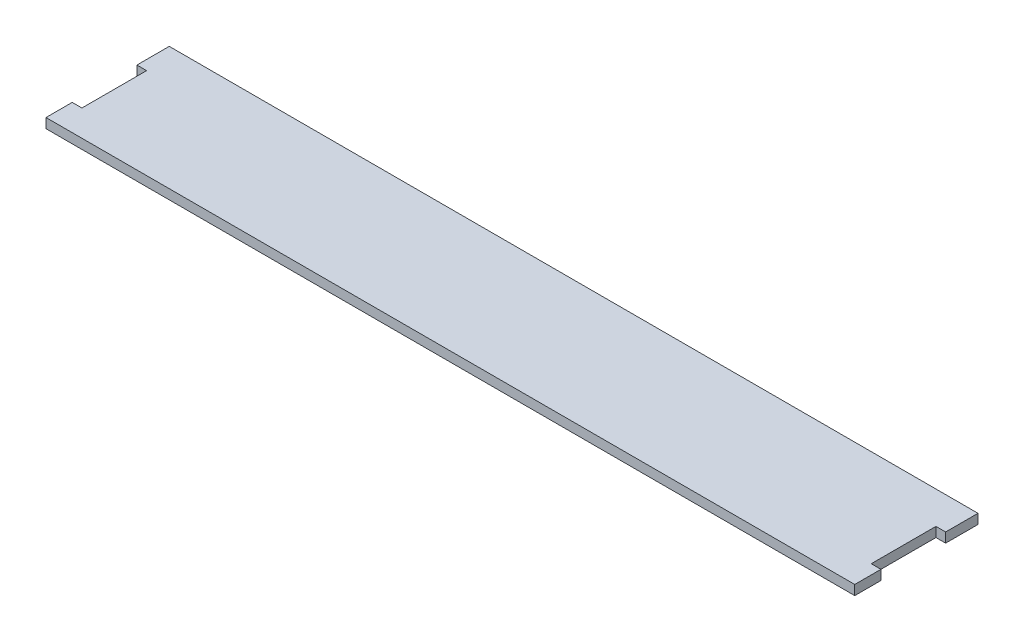
ISO-10303-21;
HEADER;
FILE_DESCRIPTION(('STEP AP214'),'2;1');
FILE_NAME('part.step','',(''),(''),'','','');
FILE_SCHEMA(('AUTOMOTIVE_DESIGN { 1 0 10303 214 1 1 1 1 }'));
ENDSEC;
DATA;
#1=APPLICATION_CONTEXT('core data for automotive mechanical design processes');
#2=APPLICATION_PROTOCOL_DEFINITION('international standard','automotive_design',2000,#1);
#3=PRODUCT_CONTEXT('',#1,'mechanical');
#4=PRODUCT('Part','Part','',(#3));
#5=PRODUCT_RELATED_PRODUCT_CATEGORY('part','',(#4));
#6=PRODUCT_DEFINITION_FORMATION('','',#4);
#7=PRODUCT_DEFINITION_CONTEXT('part definition',#1,'design');
#8=PRODUCT_DEFINITION('design','',#6,#7);
#9=PRODUCT_DEFINITION_SHAPE('','',#8);
#10=(LENGTH_UNIT() NAMED_UNIT(*) SI_UNIT(.MILLI.,.METRE.));
#11=(NAMED_UNIT(*) PLANE_ANGLE_UNIT() SI_UNIT($,.RADIAN.));
#12=(NAMED_UNIT(*) SI_UNIT($,.STERADIAN.) SOLID_ANGLE_UNIT());
#13=UNCERTAINTY_MEASURE_WITH_UNIT(LENGTH_MEASURE(1.E-05),#10,'distance_accuracy_value','');
#14=(GEOMETRIC_REPRESENTATION_CONTEXT(3) GLOBAL_UNCERTAINTY_ASSIGNED_CONTEXT((#13)) GLOBAL_UNIT_ASSIGNED_CONTEXT((#10,
#11,#12)) REPRESENTATION_CONTEXT('',''));
#15=CARTESIAN_POINT('',(0.,0.,0.));
#16=DIRECTION('',(0.,0.,1.));
#17=DIRECTION('',(1.,0.,0.));
#18=AXIS2_PLACEMENT_3D('',#15,#16,#17);
#19=CARTESIAN_POINT('',(250.,3.,0.));
#20=DIRECTION('',(-1.,0.,0.));
#21=DIRECTION('',(0.,0.,1.));
#22=AXIS2_PLACEMENT_3D('',#19,#20,#21);
#23=PLANE('',#22);
#24=DIRECTION('',(0.,0.,-1.));
#25=VECTOR('',#24,1.);
#26=CARTESIAN_POINT('',(250.,3.,0.));
#27=LINE('',#26,#25);
#28=CARTESIAN_POINT('',(250.,3.,-1.9));
#29=VERTEX_POINT('',#28);
#30=CARTESIAN_POINT('',(250.,3.,-10.));
#31=VERTEX_POINT('',#30);
#32=EDGE_CURVE('E135',#29,#31,#27,.T.);
#33=ORIENTED_EDGE('',*,*,#32,.F.);
#34=DIRECTION('',(0.,-1.,0.));
#35=VECTOR('',#34,1.);
#36=CARTESIAN_POINT('',(250.,3.001,-1.9));
#37=LINE('',#36,#35);
#38=CARTESIAN_POINT('',(250.,0.,-1.9));
#39=VERTEX_POINT('',#38);
#40=EDGE_CURVE('E122',#29,#39,#37,.T.);
#41=ORIENTED_EDGE('',*,*,#40,.T.);
#42=DIRECTION('',(0.,0.,-1.));
#43=VECTOR('',#42,1.);
#44=CARTESIAN_POINT('',(250.,0.,0.));
#45=LINE('',#44,#43);
#46=CARTESIAN_POINT('',(250.,0.,-10.));
#47=VERTEX_POINT('',#46);
#48=EDGE_CURVE('E133',#39,#47,#45,.T.);
#49=ORIENTED_EDGE('',*,*,#48,.T.);
#50=DIRECTION('',(0.,1.,0.));
#51=VECTOR('',#50,1.);
#52=CARTESIAN_POINT('',(250.,0.,-10.));
#53=LINE('',#52,#51);
#54=EDGE_CURVE('E185',#47,#31,#53,.T.);
#55=ORIENTED_EDGE('',*,*,#54,.T.);
#56=EDGE_LOOP('',(#33,#41,#49,#55));
#57=FACE_BOUND('',#56,.T.);
#58=ADVANCED_FACE('F33',(#57),#23,.F.);
#59=CARTESIAN_POINT('',(0.,3.,0.));
#60=DIRECTION('',(1.,0.,0.));
#61=DIRECTION('',(0.,0.,-1.));
#62=AXIS2_PLACEMENT_3D('',#59,#60,#61);
#63=PLANE('',#62);
#64=DIRECTION('',(0.,0.,1.));
#65=VECTOR('',#64,1.);
#66=CARTESIAN_POINT('',(0.,0.,0.));
#67=LINE('',#66,#65);
#68=CARTESIAN_POINT('',(0.,0.,-40.));
#69=VERTEX_POINT('',#68);
#70=CARTESIAN_POINT('',(0.,0.,-30.));
#71=VERTEX_POINT('',#70);
#72=EDGE_CURVE('E147',#69,#71,#67,.T.);
#73=ORIENTED_EDGE('',*,*,#72,.T.);
#74=DIRECTION('',(0.,1.,0.));
#75=VECTOR('',#74,1.);
#76=CARTESIAN_POINT('',(0.,0.,-30.));
#77=LINE('',#76,#75);
#78=CARTESIAN_POINT('',(0.,3.,-30.));
#79=VERTEX_POINT('',#78);
#80=EDGE_CURVE('E172',#71,#79,#77,.T.);
#81=ORIENTED_EDGE('',*,*,#80,.T.);
#82=DIRECTION('',(0.,0.,1.));
#83=VECTOR('',#82,1.);
#84=CARTESIAN_POINT('',(0.,3.,0.));
#85=LINE('',#84,#83);
#86=CARTESIAN_POINT('',(0.,3.,-40.));
#87=VERTEX_POINT('',#86);
#88=EDGE_CURVE('E163',#87,#79,#85,.T.);
#89=ORIENTED_EDGE('',*,*,#88,.F.);
#90=DIRECTION('',(0.,-1.,0.));
#91=VECTOR('',#90,1.);
#92=CARTESIAN_POINT('',(0.,3.,-40.));
#93=LINE('',#92,#91);
#94=EDGE_CURVE('E41',#87,#69,#93,.T.);
#95=ORIENTED_EDGE('',*,*,#94,.T.);
#96=EDGE_LOOP('',(#73,#81,#89,#95));
#97=FACE_BOUND('',#96,.T.);
#98=ADVANCED_FACE('F225',(#97),#63,.F.);
#99=CARTESIAN_POINT('',(0.,0.,-10.));
#100=VERTEX_POINT('',#99);
#101=CARTESIAN_POINT('',(0.,0.,-1.90000000000003));
#102=VERTEX_POINT('',#101);
#103=EDGE_CURVE('E175',#100,#102,#67,.T.);
#104=ORIENTED_EDGE('',*,*,#103,.T.);
#105=DIRECTION('',(0.,-1.,0.));
#106=VECTOR('',#105,1.);
#107=CARTESIAN_POINT('',(0.,3.001,-1.90000000000003));
#108=LINE('',#107,#106);
#109=CARTESIAN_POINT('',(0.,3.,-1.90000000000003));
#110=VERTEX_POINT('',#109);
#111=EDGE_CURVE('E48',#110,#102,#108,.T.);
#112=ORIENTED_EDGE('',*,*,#111,.F.);
#113=CARTESIAN_POINT('',(0.,3.,-10.));
#114=VERTEX_POINT('',#113);
#115=EDGE_CURVE('E145',#114,#110,#85,.T.);
#116=ORIENTED_EDGE('',*,*,#115,.F.);
#117=DIRECTION('',(0.,1.,0.));
#118=VECTOR('',#117,1.);
#119=CARTESIAN_POINT('',(0.,0.,-10.));
#120=LINE('',#119,#118);
#121=EDGE_CURVE('E165',#100,#114,#120,.T.);
#122=ORIENTED_EDGE('',*,*,#121,.F.);
#123=EDGE_LOOP('',(#104,#112,#116,#122));
#124=FACE_BOUND('',#123,.T.);
#125=ADVANCED_FACE('F35',(#124),#63,.F.);
#126=CARTESIAN_POINT('',(250.,3.,-30.));
#127=VERTEX_POINT('',#126);
#128=CARTESIAN_POINT('',(250.,3.,-40.));
#129=VERTEX_POINT('',#128);
#130=EDGE_CURVE('E160',#127,#129,#27,.T.);
#131=ORIENTED_EDGE('',*,*,#130,.F.);
#132=DIRECTION('',(0.,1.,0.));
#133=VECTOR('',#132,1.);
#134=CARTESIAN_POINT('',(250.,0.,-30.));
#135=LINE('',#134,#133);
#136=CARTESIAN_POINT('',(250.,0.,-30.));
#137=VERTEX_POINT('',#136);
#138=EDGE_CURVE('E193',#137,#127,#135,.T.);
#139=ORIENTED_EDGE('',*,*,#138,.F.);
#140=CARTESIAN_POINT('',(250.,0.,-40.));
#141=VERTEX_POINT('',#140);
#142=EDGE_CURVE('E143',#137,#141,#45,.T.);
#143=ORIENTED_EDGE('',*,*,#142,.T.);
#144=DIRECTION('',(0.,-1.,0.));
#145=VECTOR('',#144,1.);
#146=CARTESIAN_POINT('',(250.,3.,-40.));
#147=LINE('',#146,#145);
#148=EDGE_CURVE('E11',#129,#141,#147,.T.);
#149=ORIENTED_EDGE('',*,*,#148,.F.);
#150=EDGE_LOOP('',(#131,#139,#143,#149));
#151=FACE_BOUND('',#150,.T.);
#152=ADVANCED_FACE('F243',(#151),#23,.F.);
#153=CARTESIAN_POINT('',(0.,3.,-40.));
#154=DIRECTION('',(0.,0.,1.));
#155=DIRECTION('',(1.,0.,0.));
#156=AXIS2_PLACEMENT_3D('',#153,#154,#155);
#157=PLANE('',#156);
#158=DIRECTION('',(-1.,0.,0.));
#159=VECTOR('',#158,1.);
#160=CARTESIAN_POINT('',(0.,0.,-40.));
#161=LINE('',#160,#159);
#162=EDGE_CURVE('E142',#141,#69,#161,.T.);
#163=ORIENTED_EDGE('',*,*,#162,.T.);
#164=ORIENTED_EDGE('',*,*,#94,.F.);
#165=DIRECTION('',(-1.,0.,0.));
#166=VECTOR('',#165,1.);
#167=CARTESIAN_POINT('',(0.,3.,-40.));
#168=LINE('',#167,#166);
#169=EDGE_CURVE('E151',#129,#87,#168,.T.);
#170=ORIENTED_EDGE('',*,*,#169,.F.);
#171=ORIENTED_EDGE('',*,*,#148,.T.);
#172=EDGE_LOOP('',(#163,#164,#170,#171));
#173=FACE_BOUND('',#172,.T.);
#174=ADVANCED_FACE('F251',(#173),#157,.F.);
#175=CARTESIAN_POINT('',(0.,3.,0.));
#176=DIRECTION('',(0.,-1.,0.));
#177=DIRECTION('',(0.,0.,-1.));
#178=AXIS2_PLACEMENT_3D('',#175,#176,#177);
#179=PLANE('',#178);
#180=ORIENTED_EDGE('',*,*,#115,.T.);
#181=DIRECTION('',(-1.,0.,0.));
#182=VECTOR('',#181,1.);
#183=CARTESIAN_POINT('',(250.,3.,-1.9));
#184=LINE('',#183,#182);
#185=EDGE_CURVE('E128',#29,#110,#184,.T.);
#186=ORIENTED_EDGE('',*,*,#185,.F.);
#187=ORIENTED_EDGE('',*,*,#32,.T.);
#188=DIRECTION('',(1.,0.,0.));
#189=VECTOR('',#188,1.);
#190=CARTESIAN_POINT('',(250.,3.,-10.));
#191=LINE('',#190,#189);
#192=CARTESIAN_POINT('',(247.,3.,-10.));
#193=VERTEX_POINT('',#192);
#194=EDGE_CURVE('E200',#193,#31,#191,.T.);
#195=ORIENTED_EDGE('',*,*,#194,.F.);
#196=DIRECTION('',(0.,0.,1.));
#197=VECTOR('',#196,1.);
#198=CARTESIAN_POINT('',(247.,3.,-30.));
#199=LINE('',#198,#197);
#200=CARTESIAN_POINT('',(247.,3.,-30.));
#201=VERTEX_POINT('',#200);
#202=EDGE_CURVE('E204',#201,#193,#199,.T.);
#203=ORIENTED_EDGE('',*,*,#202,.F.);
#204=DIRECTION('',(-1.,0.,0.));
#205=VECTOR('',#204,1.);
#206=CARTESIAN_POINT('',(250.,3.,-30.));
#207=LINE('',#206,#205);
#208=EDGE_CURVE('E136',#127,#201,#207,.T.);
#209=ORIENTED_EDGE('',*,*,#208,.F.);
#210=ORIENTED_EDGE('',*,*,#130,.T.);
#211=ORIENTED_EDGE('',*,*,#169,.T.);
#212=ORIENTED_EDGE('',*,*,#88,.T.);
#213=DIRECTION('',(-1.,0.,0.));
#214=VECTOR('',#213,1.);
#215=CARTESIAN_POINT('',(0.,3.,-30.));
#216=LINE('',#215,#214);
#217=CARTESIAN_POINT('',(3.,3.,-30.));
#218=VERTEX_POINT('',#217);
#219=EDGE_CURVE('E176',#218,#79,#216,.T.);
#220=ORIENTED_EDGE('',*,*,#219,.F.);
#221=DIRECTION('',(0.,0.,-1.));
#222=VECTOR('',#221,1.);
#223=CARTESIAN_POINT('',(3.,3.,-30.));
#224=LINE('',#223,#222);
#225=CARTESIAN_POINT('',(3.,3.,-10.));
#226=VERTEX_POINT('',#225);
#227=EDGE_CURVE('E179',#226,#218,#224,.T.);
#228=ORIENTED_EDGE('',*,*,#227,.F.);
#229=DIRECTION('',(1.,0.,0.));
#230=VECTOR('',#229,1.);
#231=CARTESIAN_POINT('',(0.,3.,-10.));
#232=LINE('',#231,#230);
#233=EDGE_CURVE('E182',#114,#226,#232,.T.);
#234=ORIENTED_EDGE('',*,*,#233,.F.);
#235=EDGE_LOOP('',(#180,#186,#187,#195,#203,#209,#210,#211,#212,#220,#228,#234));
#236=FACE_BOUND('',#235,.T.);
#237=ADVANCED_FACE('F219',(#236),#179,.F.);
#238=CARTESIAN_POINT('',(0.,0.,0.));
#239=DIRECTION('',(0.,-1.,0.));
#240=DIRECTION('',(0.,0.,-1.));
#241=AXIS2_PLACEMENT_3D('',#238,#239,#240);
#242=PLANE('',#241);
#243=DIRECTION('',(1.,0.,0.));
#244=VECTOR('',#243,1.);
#245=CARTESIAN_POINT('',(250.,0.,-1.9));
#246=LINE('',#245,#244);
#247=EDGE_CURVE('E119',#102,#39,#246,.T.);
#248=ORIENTED_EDGE('',*,*,#247,.F.);
#249=ORIENTED_EDGE('',*,*,#103,.F.);
#250=DIRECTION('',(1.,0.,0.));
#251=VECTOR('',#250,1.);
#252=CARTESIAN_POINT('',(0.,0.,-10.));
#253=LINE('',#252,#251);
#254=CARTESIAN_POINT('',(3.,0.,-10.));
#255=VERTEX_POINT('',#254);
#256=EDGE_CURVE('E178',#100,#255,#253,.T.);
#257=ORIENTED_EDGE('',*,*,#256,.T.);
#258=DIRECTION('',(0.,0.,-1.));
#259=VECTOR('',#258,1.);
#260=CARTESIAN_POINT('',(3.,0.,-30.));
#261=LINE('',#260,#259);
#262=CARTESIAN_POINT('',(3.,0.,-30.));
#263=VERTEX_POINT('',#262);
#264=EDGE_CURVE('E188',#255,#263,#261,.T.);
#265=ORIENTED_EDGE('',*,*,#264,.T.);
#266=DIRECTION('',(-1.,0.,0.));
#267=VECTOR('',#266,1.);
#268=CARTESIAN_POINT('',(0.,0.,-30.));
#269=LINE('',#268,#267);
#270=EDGE_CURVE('E168',#263,#71,#269,.T.);
#271=ORIENTED_EDGE('',*,*,#270,.T.);
#272=ORIENTED_EDGE('',*,*,#72,.F.);
#273=ORIENTED_EDGE('',*,*,#162,.F.);
#274=ORIENTED_EDGE('',*,*,#142,.F.);
#275=DIRECTION('',(-1.,0.,0.));
#276=VECTOR('',#275,1.);
#277=CARTESIAN_POINT('',(250.,0.,-30.));
#278=LINE('',#277,#276);
#279=CARTESIAN_POINT('',(247.,0.,-30.));
#280=VERTEX_POINT('',#279);
#281=EDGE_CURVE('E203',#137,#280,#278,.T.);
#282=ORIENTED_EDGE('',*,*,#281,.T.);
#283=DIRECTION('',(0.,0.,1.));
#284=VECTOR('',#283,1.);
#285=CARTESIAN_POINT('',(247.,0.,-30.));
#286=LINE('',#285,#284);
#287=CARTESIAN_POINT('',(247.,0.,-10.));
#288=VERTEX_POINT('',#287);
#289=EDGE_CURVE('E56',#280,#288,#286,.T.);
#290=ORIENTED_EDGE('',*,*,#289,.T.);
#291=DIRECTION('',(1.,0.,0.));
#292=VECTOR('',#291,1.);
#293=CARTESIAN_POINT('',(250.,0.,-10.));
#294=LINE('',#293,#292);
#295=EDGE_CURVE('E141',#288,#47,#294,.T.);
#296=ORIENTED_EDGE('',*,*,#295,.T.);
#297=ORIENTED_EDGE('',*,*,#48,.F.);
#298=EDGE_LOOP('',(#248,#249,#257,#265,#271,#272,#273,#274,#282,#290,#296,#297));
#299=FACE_BOUND('',#298,.T.);
#300=ADVANCED_FACE('F139',(#299),#242,.T.);
#301=CARTESIAN_POINT('',(0.,0.,-30.));
#302=DIRECTION('',(0.,0.,-1.));
#303=DIRECTION('',(-1.,0.,0.));
#304=AXIS2_PLACEMENT_3D('',#301,#302,#303);
#305=PLANE('',#304);
#306=ORIENTED_EDGE('',*,*,#219,.T.);
#307=ORIENTED_EDGE('',*,*,#80,.F.);
#308=ORIENTED_EDGE('',*,*,#270,.F.);
#309=DIRECTION('',(0.,1.,0.));
#310=VECTOR('',#309,1.);
#311=CARTESIAN_POINT('',(3.,0.,-30.));
#312=LINE('',#311,#310);
#313=EDGE_CURVE('E170',#263,#218,#312,.T.);
#314=ORIENTED_EDGE('',*,*,#313,.T.);
#315=EDGE_LOOP('',(#306,#307,#308,#314));
#316=FACE_BOUND('',#315,.T.);
#317=ADVANCED_FACE('F230',(#316),#305,.F.);
#318=CARTESIAN_POINT('',(3.,0.,-30.));
#319=DIRECTION('',(1.,0.,0.));
#320=DIRECTION('',(0.,0.,-1.));
#321=AXIS2_PLACEMENT_3D('',#318,#319,#320);
#322=PLANE('',#321);
#323=ORIENTED_EDGE('',*,*,#227,.T.);
#324=ORIENTED_EDGE('',*,*,#313,.F.);
#325=ORIENTED_EDGE('',*,*,#264,.F.);
#326=DIRECTION('',(0.,1.,0.));
#327=VECTOR('',#326,1.);
#328=CARTESIAN_POINT('',(3.,0.,-10.));
#329=LINE('',#328,#327);
#330=EDGE_CURVE('E167',#255,#226,#329,.T.);
#331=ORIENTED_EDGE('',*,*,#330,.T.);
#332=EDGE_LOOP('',(#323,#324,#325,#331));
#333=FACE_BOUND('',#332,.T.);
#334=ADVANCED_FACE('F232',(#333),#322,.F.);
#335=CARTESIAN_POINT('',(0.,0.,-10.));
#336=DIRECTION('',(0.,0.,1.));
#337=DIRECTION('',(1.,0.,0.));
#338=AXIS2_PLACEMENT_3D('',#335,#336,#337);
#339=PLANE('',#338);
#340=ORIENTED_EDGE('',*,*,#233,.T.);
#341=ORIENTED_EDGE('',*,*,#330,.F.);
#342=ORIENTED_EDGE('',*,*,#256,.F.);
#343=ORIENTED_EDGE('',*,*,#121,.T.);
#344=EDGE_LOOP('',(#340,#341,#342,#343));
#345=FACE_BOUND('',#344,.T.);
#346=ADVANCED_FACE('F224',(#345),#339,.F.);
#347=CARTESIAN_POINT('',(250.,0.,-10.));
#348=DIRECTION('',(0.,0.,1.));
#349=DIRECTION('',(1.,0.,0.));
#350=AXIS2_PLACEMENT_3D('',#347,#348,#349);
#351=PLANE('',#350);
#352=ORIENTED_EDGE('',*,*,#194,.T.);
#353=ORIENTED_EDGE('',*,*,#54,.F.);
#354=ORIENTED_EDGE('',*,*,#295,.F.);
#355=DIRECTION('',(0.,1.,0.));
#356=VECTOR('',#355,1.);
#357=CARTESIAN_POINT('',(247.,0.,-10.));
#358=LINE('',#357,#356);
#359=EDGE_CURVE('E197',#288,#193,#358,.T.);
#360=ORIENTED_EDGE('',*,*,#359,.T.);
#361=EDGE_LOOP('',(#352,#353,#354,#360));
#362=FACE_BOUND('',#361,.T.);
#363=ADVANCED_FACE('F239',(#362),#351,.F.);
#364=CARTESIAN_POINT('',(247.,0.,-30.));
#365=DIRECTION('',(-1.,0.,0.));
#366=DIRECTION('',(0.,0.,1.));
#367=AXIS2_PLACEMENT_3D('',#364,#365,#366);
#368=PLANE('',#367);
#369=ORIENTED_EDGE('',*,*,#202,.T.);
#370=ORIENTED_EDGE('',*,*,#359,.F.);
#371=ORIENTED_EDGE('',*,*,#289,.F.);
#372=DIRECTION('',(0.,1.,0.));
#373=VECTOR('',#372,1.);
#374=CARTESIAN_POINT('',(247.,0.,-30.));
#375=LINE('',#374,#373);
#376=EDGE_CURVE('E195',#280,#201,#375,.T.);
#377=ORIENTED_EDGE('',*,*,#376,.T.);
#378=EDGE_LOOP('',(#369,#370,#371,#377));
#379=FACE_BOUND('',#378,.T.);
#380=ADVANCED_FACE('F266',(#379),#368,.F.);
#381=CARTESIAN_POINT('',(250.,0.,-30.));
#382=DIRECTION('',(0.,0.,-1.));
#383=DIRECTION('',(-1.,0.,0.));
#384=AXIS2_PLACEMENT_3D('',#381,#382,#383);
#385=PLANE('',#384);
#386=ORIENTED_EDGE('',*,*,#208,.T.);
#387=ORIENTED_EDGE('',*,*,#376,.F.);
#388=ORIENTED_EDGE('',*,*,#281,.F.);
#389=ORIENTED_EDGE('',*,*,#138,.T.);
#390=EDGE_LOOP('',(#386,#387,#388,#389));
#391=FACE_BOUND('',#390,.T.);
#392=ADVANCED_FACE('F265',(#391),#385,.F.);
#393=CARTESIAN_POINT('',(250.,3.001,-1.9));
#394=DIRECTION('',(0.,0.,-1.));
#395=DIRECTION('',(-1.,0.,0.));
#396=AXIS2_PLACEMENT_3D('',#393,#394,#395);
#397=PLANE('',#396);
#398=ORIENTED_EDGE('',*,*,#185,.T.);
#399=ORIENTED_EDGE('',*,*,#111,.T.);
#400=ORIENTED_EDGE('',*,*,#247,.T.);
#401=ORIENTED_EDGE('',*,*,#40,.F.);
#402=EDGE_LOOP('',(#398,#399,#400,#401));
#403=FACE_BOUND('',#402,.T.);
#404=ADVANCED_FACE('F121',(#403),#397,.F.);
#405=CLOSED_SHELL('',(#58,#98,#125,#152,#174,#237,#300,#317,#334,#346,#363,#380,#392,#404));
#406=MANIFOLD_SOLID_BREP('B2',#405);
#407=ADVANCED_BREP_SHAPE_REPRESENTATION('',(#18,#406),#14);
#408=SHAPE_DEFINITION_REPRESENTATION(#9,#407);
ENDSEC;
END-ISO-10303-21;
